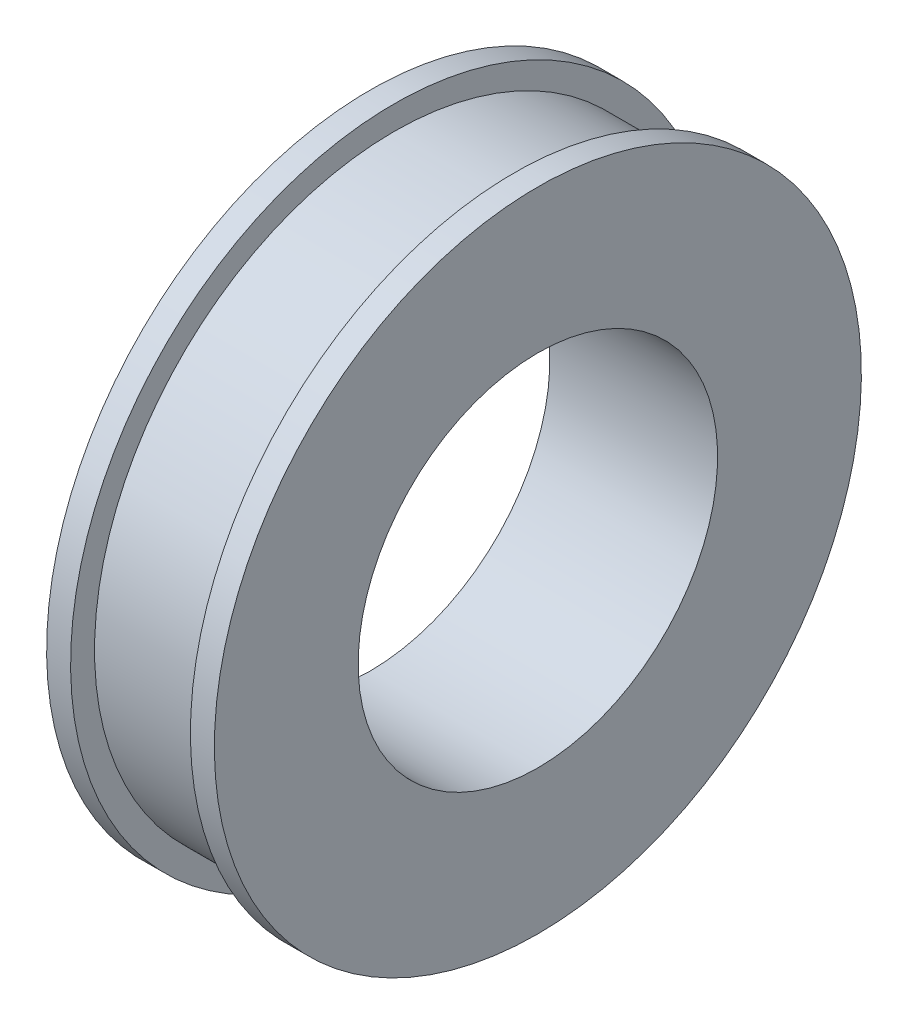
ISO-10303-21;
HEADER;
FILE_DESCRIPTION(('STEP AP214'),'2;1');
FILE_NAME('part.step','',(''),(''),'','','');
FILE_SCHEMA(('AUTOMOTIVE_DESIGN { 1 0 10303 214 1 1 1 1 }'));
ENDSEC;
DATA;
#1=APPLICATION_CONTEXT('core data for automotive mechanical design processes');
#2=APPLICATION_PROTOCOL_DEFINITION('international standard','automotive_design',2000,#1);
#3=PRODUCT_CONTEXT('',#1,'mechanical');
#4=PRODUCT('Part','Part','',(#3));
#5=PRODUCT_RELATED_PRODUCT_CATEGORY('part','',(#4));
#6=PRODUCT_DEFINITION_FORMATION('','',#4);
#7=PRODUCT_DEFINITION_CONTEXT('part definition',#1,'design');
#8=PRODUCT_DEFINITION('design','',#6,#7);
#9=PRODUCT_DEFINITION_SHAPE('','',#8);
#10=(LENGTH_UNIT() NAMED_UNIT(*) SI_UNIT(.MILLI.,.METRE.));
#11=(NAMED_UNIT(*) PLANE_ANGLE_UNIT() SI_UNIT($,.RADIAN.));
#12=(NAMED_UNIT(*) SI_UNIT($,.STERADIAN.) SOLID_ANGLE_UNIT());
#13=UNCERTAINTY_MEASURE_WITH_UNIT(LENGTH_MEASURE(1.E-05),#10,'distance_accuracy_value','');
#14=(GEOMETRIC_REPRESENTATION_CONTEXT(3) GLOBAL_UNCERTAINTY_ASSIGNED_CONTEXT((#13)) GLOBAL_UNIT_ASSIGNED_CONTEXT((#10,
#11,#12)) REPRESENTATION_CONTEXT('',''));
#15=CARTESIAN_POINT('',(0.,0.,0.));
#16=DIRECTION('',(0.,0.,1.));
#17=DIRECTION('',(1.,0.,0.));
#18=AXIS2_PLACEMENT_3D('',#15,#16,#17);
#19=CARTESIAN_POINT('',(-7.,0.,0.));
#20=DIRECTION('',(-1.,0.,0.));
#21=DIRECTION('',(0.,-1.,0.));
#22=AXIS2_PLACEMENT_3D('',#19,#20,#21);
#23=CYLINDRICAL_SURFACE('',#22,27.);
#24=CARTESIAN_POINT('',(5.00000000000001,0.,0.));
#25=DIRECTION('',(-1.,0.,0.));
#26=DIRECTION('',(0.,-1.,0.));
#27=AXIS2_PLACEMENT_3D('',#24,#25,#26);
#28=CIRCLE('',#27,27.);
#29=CARTESIAN_POINT('',(5.00000000000001,-27.,0.));
#30=VERTEX_POINT('',#29);
#31=EDGE_CURVE('E10',#30,#30,#28,.T.);
#32=ORIENTED_EDGE('',*,*,#31,.F.);
#33=EDGE_LOOP('',(#32));
#34=FACE_BOUND('',#33,.T.);
#35=CARTESIAN_POINT('',(7.00000000000001,0.,0.));
#36=DIRECTION('',(-1.,0.,0.));
#37=DIRECTION('',(0.,-1.,0.));
#38=AXIS2_PLACEMENT_3D('',#35,#36,#37);
#39=CIRCLE('',#38,27.);
#40=CARTESIAN_POINT('',(7.00000000000001,-27.,0.));
#41=VERTEX_POINT('',#40);
#42=EDGE_CURVE('E63',#41,#41,#39,.T.);
#43=ORIENTED_EDGE('',*,*,#42,.T.);
#44=EDGE_LOOP('',(#43));
#45=FACE_BOUND('',#44,.T.);
#46=ADVANCED_FACE('F35',(#34,#45),#23,.T.);
#47=CARTESIAN_POINT('',(5.,27.,0.));
#48=DIRECTION('',(1.,0.,0.));
#49=DIRECTION('',(0.,1.,0.));
#50=AXIS2_PLACEMENT_3D('',#47,#48,#49);
#51=PLANE('',#50);
#52=CARTESIAN_POINT('',(5.,0.,0.));
#53=DIRECTION('',(-1.,0.,0.));
#54=DIRECTION('',(0.,-1.,0.));
#55=AXIS2_PLACEMENT_3D('',#52,#53,#54);
#56=CIRCLE('',#55,25.);
#57=CARTESIAN_POINT('',(5.00000000000001,-25.,0.));
#58=VERTEX_POINT('',#57);
#59=EDGE_CURVE('E41',#58,#58,#56,.T.);
#60=ORIENTED_EDGE('',*,*,#59,.F.);
#61=EDGE_LOOP('',(#60));
#62=FACE_BOUND('',#61,.T.);
#63=ORIENTED_EDGE('',*,*,#31,.T.);
#64=EDGE_LOOP('',(#63));
#65=FACE_BOUND('',#64,.T.);
#66=ADVANCED_FACE('F100',(#62,#65),#51,.F.);
#67=CARTESIAN_POINT('',(-7.,0.,0.));
#68=DIRECTION('',(-1.,0.,0.));
#69=DIRECTION('',(0.,-1.,0.));
#70=AXIS2_PLACEMENT_3D('',#67,#68,#69);
#71=CYLINDRICAL_SURFACE('',#70,25.);
#72=CARTESIAN_POINT('',(-5.,0.,0.));
#73=DIRECTION('',(-1.,0.,0.));
#74=DIRECTION('',(0.,-1.,0.));
#75=AXIS2_PLACEMENT_3D('',#72,#73,#74);
#76=CIRCLE('',#75,25.);
#77=CARTESIAN_POINT('',(-4.99999999999999,-25.,0.));
#78=VERTEX_POINT('',#77);
#79=EDGE_CURVE('E45',#78,#78,#76,.T.);
#80=ORIENTED_EDGE('',*,*,#79,.F.);
#81=EDGE_LOOP('',(#80));
#82=FACE_BOUND('',#81,.T.);
#83=ORIENTED_EDGE('',*,*,#59,.T.);
#84=EDGE_LOOP('',(#83));
#85=FACE_BOUND('',#84,.T.);
#86=ADVANCED_FACE('F95',(#82,#85),#71,.T.);
#87=CARTESIAN_POINT('',(-5.,25.,0.));
#88=DIRECTION('',(-1.,0.,0.));
#89=DIRECTION('',(0.,-1.,0.));
#90=AXIS2_PLACEMENT_3D('',#87,#88,#89);
#91=PLANE('',#90);
#92=CARTESIAN_POINT('',(-5.,0.,0.));
#93=DIRECTION('',(-1.,0.,0.));
#94=DIRECTION('',(0.,-1.,0.));
#95=AXIS2_PLACEMENT_3D('',#92,#93,#94);
#96=CIRCLE('',#95,27.);
#97=CARTESIAN_POINT('',(-4.99999999999999,-27.,0.));
#98=VERTEX_POINT('',#97);
#99=EDGE_CURVE('E49',#98,#98,#96,.T.);
#100=ORIENTED_EDGE('',*,*,#99,.F.);
#101=EDGE_LOOP('',(#100));
#102=FACE_BOUND('',#101,.T.);
#103=ORIENTED_EDGE('',*,*,#79,.T.);
#104=EDGE_LOOP('',(#103));
#105=FACE_BOUND('',#104,.T.);
#106=ADVANCED_FACE('F89',(#102,#105),#91,.F.);
#107=CARTESIAN_POINT('',(-7.,0.,0.));
#108=DIRECTION('',(-1.,0.,0.));
#109=DIRECTION('',(0.,-1.,0.));
#110=AXIS2_PLACEMENT_3D('',#107,#108,#109);
#111=CYLINDRICAL_SURFACE('',#110,27.);
#112=CARTESIAN_POINT('',(-7.,0.,0.));
#113=DIRECTION('',(-1.,0.,0.));
#114=DIRECTION('',(0.,-1.,0.));
#115=AXIS2_PLACEMENT_3D('',#112,#113,#114);
#116=CIRCLE('',#115,27.);
#117=CARTESIAN_POINT('',(-6.99999999999999,-27.,0.));
#118=VERTEX_POINT('',#117);
#119=EDGE_CURVE('E54',#118,#118,#116,.T.);
#120=ORIENTED_EDGE('',*,*,#119,.F.);
#121=EDGE_LOOP('',(#120));
#122=FACE_BOUND('',#121,.T.);
#123=ORIENTED_EDGE('',*,*,#99,.T.);
#124=EDGE_LOOP('',(#123));
#125=FACE_BOUND('',#124,.T.);
#126=ADVANCED_FACE('F83',(#122,#125),#111,.T.);
#127=CARTESIAN_POINT('',(-7.,27.,0.));
#128=DIRECTION('',(1.,0.,0.));
#129=DIRECTION('',(0.,1.,0.));
#130=AXIS2_PLACEMENT_3D('',#127,#128,#129);
#131=PLANE('',#130);
#132=CARTESIAN_POINT('',(-7.,0.,0.));
#133=DIRECTION('',(-1.,0.,0.));
#134=DIRECTION('',(0.,-1.,0.));
#135=AXIS2_PLACEMENT_3D('',#132,#133,#134);
#136=CIRCLE('',#135,15.);
#137=CARTESIAN_POINT('',(-6.99999999999999,-15.,0.));
#138=VERTEX_POINT('',#137);
#139=EDGE_CURVE('E57',#138,#138,#136,.T.);
#140=ORIENTED_EDGE('',*,*,#139,.F.);
#141=EDGE_LOOP('',(#140));
#142=FACE_BOUND('',#141,.T.);
#143=ORIENTED_EDGE('',*,*,#119,.T.);
#144=EDGE_LOOP('',(#143));
#145=FACE_BOUND('',#144,.T.);
#146=ADVANCED_FACE('F77',(#142,#145),#131,.F.);
#147=CARTESIAN_POINT('',(-7.,0.,0.));
#148=DIRECTION('',(-1.,0.,0.));
#149=DIRECTION('',(0.,-1.,0.));
#150=AXIS2_PLACEMENT_3D('',#147,#148,#149);
#151=CYLINDRICAL_SURFACE('',#150,15.);
#152=CARTESIAN_POINT('',(7.,0.,0.));
#153=DIRECTION('',(-1.,0.,0.));
#154=DIRECTION('',(0.,-1.,0.));
#155=AXIS2_PLACEMENT_3D('',#152,#153,#154);
#156=CIRCLE('',#155,15.);
#157=CARTESIAN_POINT('',(7.,-15.,0.));
#158=VERTEX_POINT('',#157);
#159=EDGE_CURVE('E60',#158,#158,#156,.T.);
#160=ORIENTED_EDGE('',*,*,#159,.F.);
#161=EDGE_LOOP('',(#160));
#162=FACE_BOUND('',#161,.T.);
#163=ORIENTED_EDGE('',*,*,#139,.T.);
#164=EDGE_LOOP('',(#163));
#165=FACE_BOUND('',#164,.T.);
#166=ADVANCED_FACE('F71',(#162,#165),#151,.F.);
#167=CARTESIAN_POINT('',(7.,15.,0.));
#168=DIRECTION('',(-1.,0.,0.));
#169=DIRECTION('',(0.,-1.,0.));
#170=AXIS2_PLACEMENT_3D('',#167,#168,#169);
#171=PLANE('',#170);
#172=ORIENTED_EDGE('',*,*,#42,.F.);
#173=EDGE_LOOP('',(#172));
#174=FACE_BOUND('',#173,.T.);
#175=ORIENTED_EDGE('',*,*,#159,.T.);
#176=EDGE_LOOP('',(#175));
#177=FACE_BOUND('',#176,.T.);
#178=ADVANCED_FACE('F68',(#174,#177),#171,.F.);
#179=CLOSED_SHELL('',(#46,#66,#86,#106,#126,#146,#166,#178));
#180=MANIFOLD_SOLID_BREP('B2',#179);
#181=ADVANCED_BREP_SHAPE_REPRESENTATION('',(#18,#180),#14);
#182=SHAPE_DEFINITION_REPRESENTATION(#9,#181);
ENDSEC;
END-ISO-10303-21;
